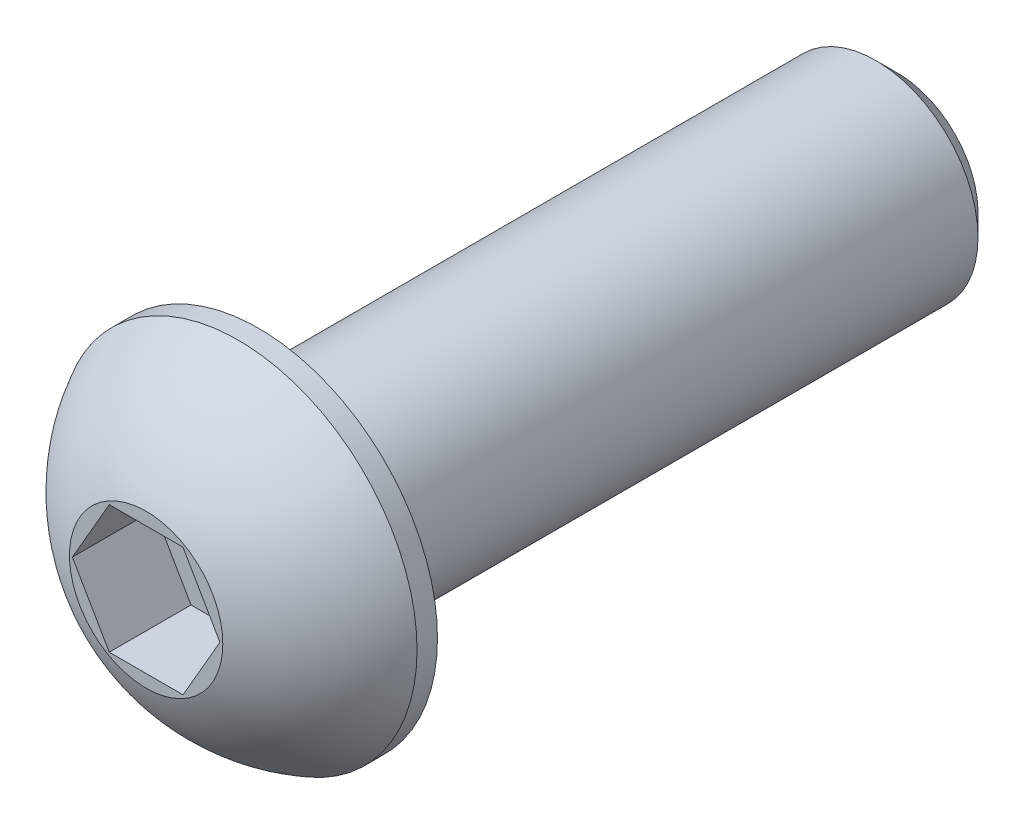
ISO-10303-21;
HEADER;
FILE_DESCRIPTION(('STEP AP214'),'2;1');
FILE_NAME('part.step','',(''),(''),'','','');
FILE_SCHEMA(('AUTOMOTIVE_DESIGN { 1 0 10303 214 1 1 1 1 }'));
ENDSEC;
DATA;
#1=APPLICATION_CONTEXT('core data for automotive mechanical design processes');
#2=APPLICATION_PROTOCOL_DEFINITION('international standard','automotive_design',2000,#1);
#3=PRODUCT_CONTEXT('',#1,'mechanical');
#4=PRODUCT('Part','Part','',(#3));
#5=PRODUCT_RELATED_PRODUCT_CATEGORY('part','',(#4));
#6=PRODUCT_DEFINITION_FORMATION('','',#4);
#7=PRODUCT_DEFINITION_CONTEXT('part definition',#1,'design');
#8=PRODUCT_DEFINITION('design','',#6,#7);
#9=PRODUCT_DEFINITION_SHAPE('','',#8);
#10=(LENGTH_UNIT() NAMED_UNIT(*) SI_UNIT(.MILLI.,.METRE.));
#11=(NAMED_UNIT(*) PLANE_ANGLE_UNIT() SI_UNIT($,.RADIAN.));
#12=(NAMED_UNIT(*) SI_UNIT($,.STERADIAN.) SOLID_ANGLE_UNIT());
#13=UNCERTAINTY_MEASURE_WITH_UNIT(LENGTH_MEASURE(1.E-05),#10,'distance_accuracy_value','');
#14=(GEOMETRIC_REPRESENTATION_CONTEXT(3) GLOBAL_UNCERTAINTY_ASSIGNED_CONTEXT((#13)) GLOBAL_UNIT_ASSIGNED_CONTEXT((#10,
#11,#12)) REPRESENTATION_CONTEXT('',''));
#15=CARTESIAN_POINT('',(0.,0.,0.));
#16=DIRECTION('',(0.,0.,1.));
#17=DIRECTION('',(1.,0.,0.));
#18=AXIS2_PLACEMENT_3D('',#15,#16,#17);
#19=CARTESIAN_POINT('',(0.,0.,1.2));
#20=DIRECTION('',(0.,0.,1.));
#21=DIRECTION('',(1.,0.,0.));
#22=AXIS2_PLACEMENT_3D('',#19,#20,#21);
#23=PLANE('',#22);
#24=DIRECTION('',(0.5,0.866025403784438,0.));
#25=VECTOR('',#24,1.);
#26=CARTESIAN_POINT('',(2.88675134594819,0.,1.2));
#27=LINE('',#26,#25);
#28=CARTESIAN_POINT('',(1.44337567297411,-2.5,1.2));
#29=VERTEX_POINT('',#28);
#30=CARTESIAN_POINT('',(2.88675134594819,0.,1.2));
#31=VERTEX_POINT('',#30);
#32=EDGE_CURVE('E76',#29,#31,#27,.T.);
#33=ORIENTED_EDGE('',*,*,#32,.T.);
#34=DIRECTION('',(-0.5,0.866025403784438,0.));
#35=VECTOR('',#34,1.);
#36=CARTESIAN_POINT('',(1.44337567297411,2.5,1.2));
#37=LINE('',#36,#35);
#38=CARTESIAN_POINT('',(1.44337567297411,2.5,1.2));
#39=VERTEX_POINT('',#38);
#40=EDGE_CURVE('E78',#31,#39,#37,.T.);
#41=ORIENTED_EDGE('',*,*,#40,.T.);
#42=DIRECTION('',(1.,0.,0.));
#43=VECTOR('',#42,1.);
#44=CARTESIAN_POINT('',(-1.443375672974,2.5,1.2));
#45=LINE('',#44,#43);
#46=CARTESIAN_POINT('',(-1.443375672974,2.5,1.2));
#47=VERTEX_POINT('',#46);
#48=EDGE_CURVE('E63',#39,#47,#45,.F.);
#49=ORIENTED_EDGE('',*,*,#48,.T.);
#50=DIRECTION('',(-0.500000000000013,-0.866025403784431,0.));
#51=VECTOR('',#50,1.);
#52=CARTESIAN_POINT('',(-2.88675134594811,0.,1.2));
#53=LINE('',#52,#51);
#54=CARTESIAN_POINT('',(-2.88675134594811,0.,1.2));
#55=VERTEX_POINT('',#54);
#56=EDGE_CURVE('E108',#47,#55,#53,.T.);
#57=ORIENTED_EDGE('',*,*,#56,.T.);
#58=DIRECTION('',(0.500000000000013,-0.866025403784431,0.));
#59=VECTOR('',#58,1.);
#60=CARTESIAN_POINT('',(-1.443375672974,-2.5,1.2));
#61=LINE('',#60,#59);
#62=CARTESIAN_POINT('',(-1.443375672974,-2.5,1.2));
#63=VERTEX_POINT('',#62);
#64=EDGE_CURVE('E103',#55,#63,#61,.T.);
#65=ORIENTED_EDGE('',*,*,#64,.T.);
#66=DIRECTION('',(1.,0.,0.));
#67=VECTOR('',#66,1.);
#68=CARTESIAN_POINT('',(1.44337567297411,-2.5,1.2));
#69=LINE('',#68,#67);
#70=EDGE_CURVE('E80',#63,#29,#69,.T.);
#71=ORIENTED_EDGE('',*,*,#70,.T.);
#72=EDGE_LOOP('',(#33,#41,#49,#57,#65,#71));
#73=FACE_BOUND('',#72,.T.);
#74=ADVANCED_FACE('F16',(#73),#23,.T.);
#75=CARTESIAN_POINT('',(1.44337567297411,2.5,1.2));
#76=DIRECTION('',(0.866025403784438,0.5,0.));
#77=DIRECTION('',(-0.5,0.866025403784438,0.));
#78=AXIS2_PLACEMENT_3D('',#75,#76,#77);
#79=PLANE('',#78);
#80=DIRECTION('',(0.,0.,1.));
#81=VECTOR('',#80,1.);
#82=CARTESIAN_POINT('',(1.44337567297411,2.5,1.2));
#83=LINE('',#82,#81);
#84=CARTESIAN_POINT('',(1.44337567297411,2.5,4.4));
#85=VERTEX_POINT('',#84);
#86=EDGE_CURVE('E89',#85,#39,#83,.F.);
#87=ORIENTED_EDGE('',*,*,#86,.T.);
#88=ORIENTED_EDGE('',*,*,#40,.F.);
#89=DIRECTION('',(0.,0.,1.));
#90=VECTOR('',#89,1.);
#91=CARTESIAN_POINT('',(2.88675134594819,0.,1.2));
#92=LINE('',#91,#90);
#93=CARTESIAN_POINT('',(2.88675134594819,0.,4.4));
#94=VERTEX_POINT('',#93);
#95=EDGE_CURVE('E85',#31,#94,#92,.T.);
#96=ORIENTED_EDGE('',*,*,#95,.T.);
#97=DIRECTION('',(0.5,-0.866025403784438,0.));
#98=VECTOR('',#97,1.);
#99=CARTESIAN_POINT('',(1.44337567297411,2.5,4.4));
#100=LINE('',#99,#98);
#101=EDGE_CURVE('E56',#85,#94,#100,.T.);
#102=ORIENTED_EDGE('',*,*,#101,.F.);
#103=EDGE_LOOP('',(#87,#88,#96,#102));
#104=FACE_BOUND('',#103,.T.);
#105=ADVANCED_FACE('F87',(#104),#79,.F.);
#106=CARTESIAN_POINT('',(2.88675134594819,0.,1.2));
#107=DIRECTION('',(0.866025403784438,-0.5,0.));
#108=DIRECTION('',(0.5,0.866025403784438,0.));
#109=AXIS2_PLACEMENT_3D('',#106,#107,#108);
#110=PLANE('',#109);
#111=ORIENTED_EDGE('',*,*,#95,.F.);
#112=ORIENTED_EDGE('',*,*,#32,.F.);
#113=DIRECTION('',(0.,0.,-1.));
#114=VECTOR('',#113,1.);
#115=CARTESIAN_POINT('',(1.44337567297411,-2.5,1.2));
#116=LINE('',#115,#114);
#117=CARTESIAN_POINT('',(1.44337567297411,-2.5,4.4));
#118=VERTEX_POINT('',#117);
#119=EDGE_CURVE('E99',#29,#118,#116,.F.);
#120=ORIENTED_EDGE('',*,*,#119,.T.);
#121=DIRECTION('',(-0.5,-0.866025403784438,0.));
#122=VECTOR('',#121,1.);
#123=CARTESIAN_POINT('',(2.88675134594819,0.,4.4));
#124=LINE('',#123,#122);
#125=EDGE_CURVE('E94',#94,#118,#124,.T.);
#126=ORIENTED_EDGE('',*,*,#125,.F.);
#127=EDGE_LOOP('',(#111,#112,#120,#126));
#128=FACE_BOUND('',#127,.T.);
#129=ADVANCED_FACE('F92',(#128),#110,.F.);
#130=CARTESIAN_POINT('',(1.44337567297411,-2.5,1.2));
#131=DIRECTION('',(0.,-1.,0.));
#132=DIRECTION('',(0.,0.,-1.));
#133=AXIS2_PLACEMENT_3D('',#130,#131,#132);
#134=PLANE('',#133);
#135=ORIENTED_EDGE('',*,*,#119,.F.);
#136=ORIENTED_EDGE('',*,*,#70,.F.);
#137=DIRECTION('',(0.,0.,1.));
#138=VECTOR('',#137,1.);
#139=CARTESIAN_POINT('',(-1.443375672974,-2.5,1.2));
#140=LINE('',#139,#138);
#141=CARTESIAN_POINT('',(-1.443375672974,-2.5,4.4));
#142=VERTEX_POINT('',#141);
#143=EDGE_CURVE('E105',#63,#142,#140,.T.);
#144=ORIENTED_EDGE('',*,*,#143,.T.);
#145=DIRECTION('',(1.,0.,0.));
#146=VECTOR('',#145,1.);
#147=CARTESIAN_POINT('',(1.5,-2.5,4.4));
#148=LINE('',#147,#146);
#149=EDGE_CURVE('E134',#118,#142,#148,.F.);
#150=ORIENTED_EDGE('',*,*,#149,.F.);
#151=EDGE_LOOP('',(#135,#136,#144,#150));
#152=FACE_BOUND('',#151,.T.);
#153=ADVANCED_FACE('F213',(#152),#134,.F.);
#154=CARTESIAN_POINT('',(-1.443375672974,-2.5,1.2));
#155=DIRECTION('',(-0.866025403784431,-0.500000000000013,0.));
#156=DIRECTION('',(0.500000000000013,-0.866025403784431,0.));
#157=AXIS2_PLACEMENT_3D('',#154,#155,#156);
#158=PLANE('',#157);
#159=ORIENTED_EDGE('',*,*,#143,.F.);
#160=ORIENTED_EDGE('',*,*,#64,.F.);
#161=DIRECTION('',(0.,0.,1.));
#162=VECTOR('',#161,1.);
#163=CARTESIAN_POINT('',(-2.88675134594811,0.,1.2));
#164=LINE('',#163,#162);
#165=CARTESIAN_POINT('',(-2.88675134594811,0.,4.4));
#166=VERTEX_POINT('',#165);
#167=EDGE_CURVE('E111',#55,#166,#164,.T.);
#168=ORIENTED_EDGE('',*,*,#167,.T.);
#169=DIRECTION('',(-0.500000000000013,0.866025403784431,0.));
#170=VECTOR('',#169,1.);
#171=CARTESIAN_POINT('',(-1.443375672974,-2.5,4.4));
#172=LINE('',#171,#170);
#173=EDGE_CURVE('E130',#142,#166,#172,.T.);
#174=ORIENTED_EDGE('',*,*,#173,.F.);
#175=EDGE_LOOP('',(#159,#160,#168,#174));
#176=FACE_BOUND('',#175,.T.);
#177=ADVANCED_FACE('F210',(#176),#158,.F.);
#178=CARTESIAN_POINT('',(-2.88675134594811,0.,1.2));
#179=DIRECTION('',(-0.866025403784431,0.500000000000013,0.));
#180=DIRECTION('',(-0.500000000000013,-0.866025403784431,0.));
#181=AXIS2_PLACEMENT_3D('',#178,#179,#180);
#182=PLANE('',#181);
#183=ORIENTED_EDGE('',*,*,#167,.F.);
#184=ORIENTED_EDGE('',*,*,#56,.F.);
#185=DIRECTION('',(0.,0.,1.));
#186=VECTOR('',#185,1.);
#187=CARTESIAN_POINT('',(-1.443375672974,2.5,1.2));
#188=LINE('',#187,#186);
#189=CARTESIAN_POINT('',(-1.443375672974,2.5,4.4));
#190=VERTEX_POINT('',#189);
#191=EDGE_CURVE('E36',#47,#190,#188,.T.);
#192=ORIENTED_EDGE('',*,*,#191,.T.);
#193=DIRECTION('',(0.500000000000013,0.866025403784431,0.));
#194=VECTOR('',#193,1.);
#195=CARTESIAN_POINT('',(-2.88675134594811,0.,4.4));
#196=LINE('',#195,#194);
#197=EDGE_CURVE('E126',#166,#190,#196,.T.);
#198=ORIENTED_EDGE('',*,*,#197,.F.);
#199=EDGE_LOOP('',(#183,#184,#192,#198));
#200=FACE_BOUND('',#199,.T.);
#201=ADVANCED_FACE('F204',(#200),#182,.F.);
#202=CARTESIAN_POINT('',(-1.443375672974,2.5,1.2));
#203=DIRECTION('',(0.,1.,0.));
#204=DIRECTION('',(0.,0.,1.));
#205=AXIS2_PLACEMENT_3D('',#202,#203,#204);
#206=PLANE('',#205);
#207=ORIENTED_EDGE('',*,*,#191,.F.);
#208=ORIENTED_EDGE('',*,*,#48,.F.);
#209=ORIENTED_EDGE('',*,*,#86,.F.);
#210=DIRECTION('',(1.,0.,0.));
#211=VECTOR('',#210,1.);
#212=CARTESIAN_POINT('',(1.5,2.5,4.4));
#213=LINE('',#212,#211);
#214=EDGE_CURVE('E122',#190,#85,#213,.T.);
#215=ORIENTED_EDGE('',*,*,#214,.F.);
#216=EDGE_LOOP('',(#207,#208,#209,#215));
#217=FACE_BOUND('',#216,.T.);
#218=ADVANCED_FACE('F197',(#217),#206,.F.);
#219=CARTESIAN_POINT('',(1.575,0.,-25.));
#220=DIRECTION('',(0.,0.,-1.));
#221=DIRECTION('',(-1.,0.,0.));
#222=AXIS2_PLACEMENT_3D('',#219,#220,#221);
#223=PLANE('',#222);
#224=CARTESIAN_POINT('',(0.,0.,-25.0000000000341));
#225=DIRECTION('',(0.,0.,1.));
#226=DIRECTION('',(0.,-1.,0.));
#227=AXIS2_PLACEMENT_3D('',#224,#225,#226);
#228=CIRCLE('',#227,3.15000000006193);
#229=CARTESIAN_POINT('',(0.,-3.15000000006193,-25.0000000000341));
#230=VERTEX_POINT('',#229);
#231=EDGE_CURVE('E20',#230,#230,#228,.T.);
#232=ORIENTED_EDGE('',*,*,#231,.F.);
#233=EDGE_LOOP('',(#232));
#234=FACE_BOUND('',#233,.T.);
#235=ADVANCED_FACE('F194',(#234),#223,.T.);
#236=CARTESIAN_POINT('',(1.5,0.,4.4));
#237=DIRECTION('',(0.,0.,1.));
#238=DIRECTION('',(1.,0.,0.));
#239=AXIS2_PLACEMENT_3D('',#236,#237,#238);
#240=PLANE('',#239);
#241=CARTESIAN_POINT('',(0.,0.,4.4));
#242=DIRECTION('',(0.,0.,1.));
#243=DIRECTION('',(1.,0.,0.));
#244=AXIS2_PLACEMENT_3D('',#241,#242,#243);
#245=CIRCLE('',#244,3.);
#246=CARTESIAN_POINT('',(3.,0.,4.4));
#247=VERTEX_POINT('',#246);
#248=EDGE_CURVE('E184',#247,#247,#245,.F.);
#249=ORIENTED_EDGE('',*,*,#248,.F.);
#250=EDGE_LOOP('',(#249));
#251=FACE_BOUND('',#250,.T.);
#252=ORIENTED_EDGE('',*,*,#197,.T.);
#253=ORIENTED_EDGE('',*,*,#214,.T.);
#254=ORIENTED_EDGE('',*,*,#101,.T.);
#255=ORIENTED_EDGE('',*,*,#125,.T.);
#256=ORIENTED_EDGE('',*,*,#149,.T.);
#257=ORIENTED_EDGE('',*,*,#173,.T.);
#258=EDGE_LOOP('',(#252,#253,#254,#255,#256,#257));
#259=FACE_BOUND('',#258,.T.);
#260=ADVANCED_FACE('F196',(#251,#259),#240,.T.);
#261=CARTESIAN_POINT('',(0.,0.,-24.1500000001338));
#262=DIRECTION('',(0.,0.,1.));
#263=DIRECTION('',(0.,-1.,0.));
#264=AXIS2_PLACEMENT_3D('',#261,#262,#263);
#265=CONICAL_SURFACE('',#264,3.99999999996226,0.785398163397448);
#266=CARTESIAN_POINT('',(0.,0.,-24.15));
#267=DIRECTION('',(0.,0.,1.));
#268=DIRECTION('',(1.,0.,0.));
#269=AXIS2_PLACEMENT_3D('',#266,#267,#268);
#270=CIRCLE('',#269,4.);
#271=CARTESIAN_POINT('',(4.,0.,-24.15));
#272=VERTEX_POINT('',#271);
#273=EDGE_CURVE('E180',#272,#272,#270,.T.);
#274=ORIENTED_EDGE('',*,*,#273,.F.);
#275=EDGE_LOOP('',(#274));
#276=FACE_BOUND('',#275,.T.);
#277=ORIENTED_EDGE('',*,*,#231,.T.);
#278=EDGE_LOOP('',(#277));
#279=FACE_BOUND('',#278,.T.);
#280=ADVANCED_FACE('F152',(#276,#279),#265,.T.);
#281=CARTESIAN_POINT('',(0.31676907106838,0.,-2.60358992103512));
#282=DIRECTION('',(0.,1.,0.));
#283=DIRECTION('',(1.,0.,0.));
#284=AXIS2_PLACEMENT_3D('',#281,#282,#283);
#285=CIRCLE('',#284,7.5);
#286=TRIMMED_CURVE('',#285,(PARAMETER_VALUE(-1.61304477024159)),
(PARAMETER_VALUE(1.61304477024159)),.T.,.PARAMETER.);
#287=CARTESIAN_POINT('',(0.,0.,-2.60358992103512));
#288=DIRECTION('',(0.,0.,1.));
#289=AXIS1_PLACEMENT('',#287,#288);
#290=SURFACE_OF_REVOLUTION('',#286,#289);
#291=ORIENTED_EDGE('',*,*,#248,.T.);
#292=EDGE_LOOP('',(#291));
#293=FACE_BOUND('',#292,.T.);
#294=CARTESIAN_POINT('',(0.,0.,0.799999999999986));
#295=DIRECTION('',(0.,0.,1.));
#296=DIRECTION('',(1.,0.,0.));
#297=AXIS2_PLACEMENT_3D('',#294,#295,#296);
#298=CIRCLE('',#297,7.);
#299=CARTESIAN_POINT('',(7.,0.,0.799999999999986));
#300=VERTEX_POINT('',#299);
#301=EDGE_CURVE('E174',#300,#300,#298,.F.);
#302=ORIENTED_EDGE('',*,*,#301,.F.);
#303=EDGE_LOOP('',(#302));
#304=FACE_BOUND('',#303,.T.);
#305=ADVANCED_FACE('F147',(#293,#304),#290,.F.);
#306=CARTESIAN_POINT('',(0.,0.,-24.15));
#307=DIRECTION('',(0.,0.,1.));
#308=DIRECTION('',(1.,0.,0.));
#309=AXIS2_PLACEMENT_3D('',#306,#307,#308);
#310=CYLINDRICAL_SURFACE('',#309,4.);
#311=CARTESIAN_POINT('',(0.,0.,-0.999999999976353));
#312=DIRECTION('',(0.,0.,1.));
#313=DIRECTION('',(1.,0.,0.));
#314=AXIS2_PLACEMENT_3D('',#311,#312,#313);
#315=CIRCLE('',#314,3.99999999996226);
#316=CARTESIAN_POINT('',(3.99999999996226,0.,-0.999999999976353));
#317=VERTEX_POINT('',#316);
#318=EDGE_CURVE('E144',#317,#317,#315,.T.);
#319=ORIENTED_EDGE('',*,*,#318,.F.);
#320=EDGE_LOOP('',(#319));
#321=FACE_BOUND('',#320,.T.);
#322=ORIENTED_EDGE('',*,*,#273,.T.);
#323=EDGE_LOOP('',(#322));
#324=FACE_BOUND('',#323,.T.);
#325=ADVANCED_FACE('F151',(#321,#324),#310,.T.);
#326=CARTESIAN_POINT('',(0.,0.,-2.94198259503942E-13));
#327=DIRECTION('',(0.,0.,1.));
#328=DIRECTION('',(1.,0.,0.));
#329=AXIS2_PLACEMENT_3D('',#326,#327,#328);
#330=CYLINDRICAL_SURFACE('',#329,7.);
#331=ORIENTED_EDGE('',*,*,#301,.T.);
#332=EDGE_LOOP('',(#331));
#333=FACE_BOUND('',#332,.T.);
#334=CARTESIAN_POINT('',(0.,0.,-2.9430667972119E-13));
#335=DIRECTION('',(0.,0.,1.));
#336=DIRECTION('',(1.,0.,0.));
#337=AXIS2_PLACEMENT_3D('',#334,#335,#336);
#338=CIRCLE('',#337,7.);
#339=CARTESIAN_POINT('',(7.,0.,-2.9430667972119E-13));
#340=VERTEX_POINT('',#339);
#341=EDGE_CURVE('E27',#340,#340,#338,.F.);
#342=ORIENTED_EDGE('',*,*,#341,.F.);
#343=EDGE_LOOP('',(#342));
#344=FACE_BOUND('',#343,.T.);
#345=ADVANCED_FACE('F157',(#333,#344),#330,.T.);
#346=CARTESIAN_POINT('',(0.,0.,0.));
#347=DIRECTION('',(0.,0.,1.));
#348=DIRECTION('',(1.,0.,0.));
#349=AXIS2_PLACEMENT_3D('',#346,#347,#348);
#350=CONICAL_SURFACE('',#349,4.59999999992533,0.540419500253865);
#351=CARTESIAN_POINT('',(0.,0.,0.));
#352=DIRECTION('',(0.,0.,1.));
#353=DIRECTION('',(1.,0.,0.));
#354=AXIS2_PLACEMENT_3D('',#351,#352,#353);
#355=CIRCLE('',#354,4.59999999992533);
#356=CARTESIAN_POINT('',(4.59999999992533,0.,0.));
#357=VERTEX_POINT('',#356);
#358=EDGE_CURVE('E10',#357,#357,#355,.T.);
#359=ORIENTED_EDGE('',*,*,#358,.F.);
#360=EDGE_LOOP('',(#359));
#361=FACE_BOUND('',#360,.T.);
#362=ORIENTED_EDGE('',*,*,#318,.T.);
#363=EDGE_LOOP('',(#362));
#364=FACE_BOUND('',#363,.T.);
#365=ADVANCED_FACE('F160',(#361,#364),#350,.T.);
#366=CARTESIAN_POINT('',(5.8,0.,-2.94320123828129E-13));
#367=DIRECTION('',(0.,0.,-1.));
#368=DIRECTION('',(-1.,0.,0.));
#369=AXIS2_PLACEMENT_3D('',#366,#367,#368);
#370=PLANE('',#369);
#371=ORIENTED_EDGE('',*,*,#358,.T.);
#372=EDGE_LOOP('',(#371));
#373=FACE_BOUND('',#372,.T.);
#374=ORIENTED_EDGE('',*,*,#341,.T.);
#375=EDGE_LOOP('',(#374));
#376=FACE_BOUND('',#375,.T.);
#377=ADVANCED_FACE('F18',(#373,#376),#370,.T.);
#378=CLOSED_SHELL('',(#74,#105,#129,#153,#177,#201,#218,#235,#260,#280,#305,#325,#345,#365,#377));
#379=MANIFOLD_SOLID_BREP('B1',#378);
#380=ADVANCED_BREP_SHAPE_REPRESENTATION('',(#18,#379),#14);
#381=SHAPE_DEFINITION_REPRESENTATION(#9,#380);
ENDSEC;
END-ISO-10303-21;
